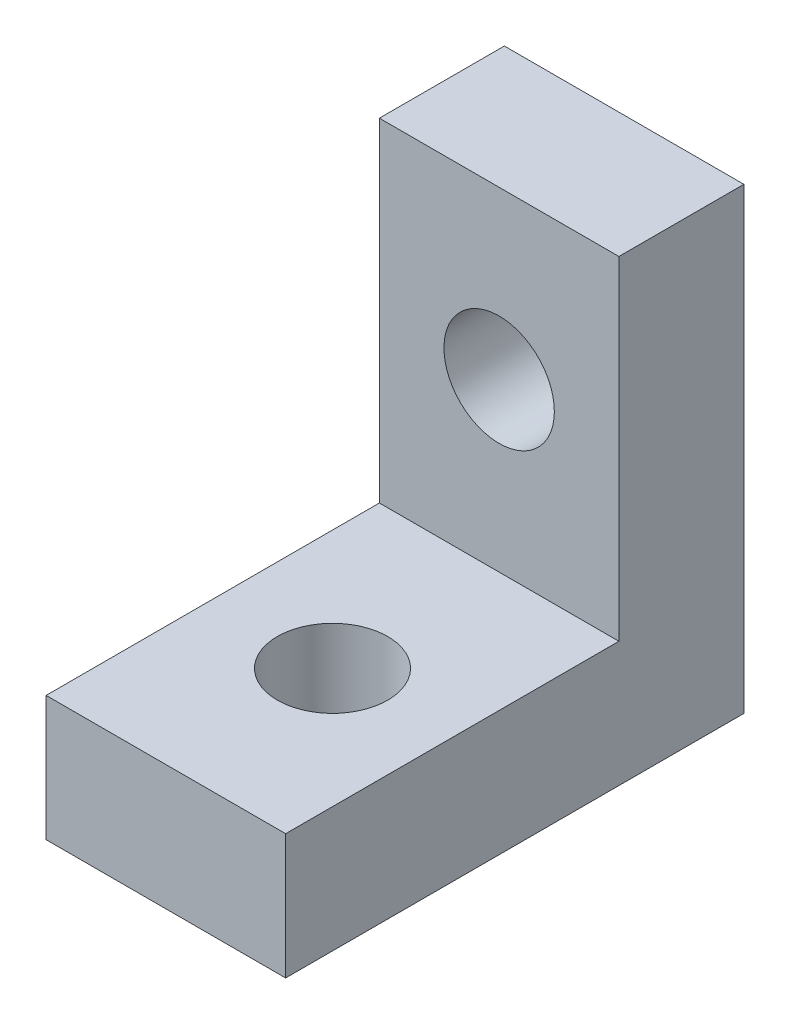
ISO-10303-21;
HEADER;
FILE_DESCRIPTION(('STEP AP214'),'2;1');
FILE_NAME('part.step','',(''),(''),'','','');
FILE_SCHEMA(('AUTOMOTIVE_DESIGN { 1 0 10303 214 1 1 1 1 }'));
ENDSEC;
DATA;
#1=APPLICATION_CONTEXT('core data for automotive mechanical design processes');
#2=APPLICATION_PROTOCOL_DEFINITION('international standard','automotive_design',2000,#1);
#3=PRODUCT_CONTEXT('',#1,'mechanical');
#4=PRODUCT('Part','Part','',(#3));
#5=PRODUCT_RELATED_PRODUCT_CATEGORY('part','',(#4));
#6=PRODUCT_DEFINITION_FORMATION('','',#4);
#7=PRODUCT_DEFINITION_CONTEXT('part definition',#1,'design');
#8=PRODUCT_DEFINITION('design','',#6,#7);
#9=PRODUCT_DEFINITION_SHAPE('','',#8);
#10=(LENGTH_UNIT() NAMED_UNIT(*) SI_UNIT(.MILLI.,.METRE.));
#11=(NAMED_UNIT(*) PLANE_ANGLE_UNIT() SI_UNIT($,.RADIAN.));
#12=(NAMED_UNIT(*) SI_UNIT($,.STERADIAN.) SOLID_ANGLE_UNIT());
#13=UNCERTAINTY_MEASURE_WITH_UNIT(LENGTH_MEASURE(1.E-05),#10,'distance_accuracy_value','');
#14=(GEOMETRIC_REPRESENTATION_CONTEXT(3) GLOBAL_UNCERTAINTY_ASSIGNED_CONTEXT((#13)) GLOBAL_UNIT_ASSIGNED_CONTEXT((#10,
#11,#12)) REPRESENTATION_CONTEXT('',''));
#15=CARTESIAN_POINT('',(0.,0.,0.));
#16=DIRECTION('',(0.,0.,1.));
#17=DIRECTION('',(1.,0.,0.));
#18=AXIS2_PLACEMENT_3D('',#15,#16,#17);
#19=CARTESIAN_POINT('',(-11.5,6.,0.));
#20=DIRECTION('',(0.,0.,1.));
#21=DIRECTION('',(0.,-1.,0.));
#22=AXIS2_PLACEMENT_3D('',#19,#20,#21);
#23=PLANE('',#22);
#24=DIRECTION('',(0.,-1.,0.));
#25=VECTOR('',#24,1.);
#26=CARTESIAN_POINT('',(0.,6.,0.));
#27=LINE('',#26,#25);
#28=CARTESIAN_POINT('',(0.,6.,0.));
#29=VERTEX_POINT('',#28);
#30=CARTESIAN_POINT('',(0.,0.,0.));
#31=VERTEX_POINT('',#30);
#32=EDGE_CURVE('E117',#29,#31,#27,.T.);
#33=ORIENTED_EDGE('',*,*,#32,.F.);
#34=DIRECTION('',(1.,0.,0.));
#35=VECTOR('',#34,1.);
#36=CARTESIAN_POINT('',(-11.5,6.,0.));
#37=LINE('',#36,#35);
#38=CARTESIAN_POINT('',(-11.5,6.,0.));
#39=VERTEX_POINT('',#38);
#40=EDGE_CURVE('E11',#39,#29,#37,.T.);
#41=ORIENTED_EDGE('',*,*,#40,.F.);
#42=DIRECTION('',(0.,-1.,0.));
#43=VECTOR('',#42,1.);
#44=CARTESIAN_POINT('',(-11.5,6.,0.));
#45=LINE('',#44,#43);
#46=CARTESIAN_POINT('',(-11.5,0.,0.));
#47=VERTEX_POINT('',#46);
#48=EDGE_CURVE('E132',#39,#47,#45,.T.);
#49=ORIENTED_EDGE('',*,*,#48,.T.);
#50=DIRECTION('',(1.,0.,0.));
#51=VECTOR('',#50,1.);
#52=CARTESIAN_POINT('',(-11.5,0.,0.));
#53=LINE('',#52,#51);
#54=EDGE_CURVE('E35',#47,#31,#53,.T.);
#55=ORIENTED_EDGE('',*,*,#54,.T.);
#56=EDGE_LOOP('',(#33,#41,#49,#55));
#57=FACE_BOUND('',#56,.T.);
#58=ADVANCED_FACE('F32',(#57),#23,.T.);
#59=CARTESIAN_POINT('',(-11.5,6.,-16.));
#60=DIRECTION('',(0.,1.,0.));
#61=DIRECTION('',(0.,0.,1.));
#62=AXIS2_PLACEMENT_3D('',#59,#60,#61);
#63=PLANE('',#62);
#64=CARTESIAN_POINT('',(-5.75,6.,-8.));
#65=DIRECTION('',(0.,1.,0.));
#66=DIRECTION('',(0.,0.,1.));
#67=AXIS2_PLACEMENT_3D('',#64,#65,#66);
#68=CIRCLE('',#67,2.65);
#69=CARTESIAN_POINT('',(-5.75,6.,-5.35));
#70=VERTEX_POINT('',#69);
#71=EDGE_CURVE('E167',#70,#70,#68,.T.);
#72=ORIENTED_EDGE('',*,*,#71,.F.);
#73=EDGE_LOOP('',(#72));
#74=FACE_BOUND('',#73,.T.);
#75=DIRECTION('',(0.,0.,1.));
#76=VECTOR('',#75,1.);
#77=CARTESIAN_POINT('',(0.,6.,-16.));
#78=LINE('',#77,#76);
#79=CARTESIAN_POINT('',(0.,6.,-16.));
#80=VERTEX_POINT('',#79);
#81=EDGE_CURVE('E130',#80,#29,#78,.T.);
#82=ORIENTED_EDGE('',*,*,#81,.F.);
#83=DIRECTION('',(1.,0.,0.));
#84=VECTOR('',#83,1.);
#85=CARTESIAN_POINT('',(-11.5,6.,-16.));
#86=LINE('',#85,#84);
#87=CARTESIAN_POINT('',(-11.5,6.,-16.));
#88=VERTEX_POINT('',#87);
#89=EDGE_CURVE('E41',#88,#80,#86,.T.);
#90=ORIENTED_EDGE('',*,*,#89,.F.);
#91=DIRECTION('',(0.,0.,1.));
#92=VECTOR('',#91,1.);
#93=CARTESIAN_POINT('',(-11.5,6.,-16.));
#94=LINE('',#93,#92);
#95=EDGE_CURVE('E107',#88,#39,#94,.T.);
#96=ORIENTED_EDGE('',*,*,#95,.T.);
#97=ORIENTED_EDGE('',*,*,#40,.T.);
#98=EDGE_LOOP('',(#82,#90,#96,#97));
#99=FACE_BOUND('',#98,.T.);
#100=ADVANCED_FACE('F140',(#74,#99),#63,.T.);
#101=CARTESIAN_POINT('',(-11.5,22.,-16.));
#102=DIRECTION('',(0.,0.,1.));
#103=DIRECTION('',(0.,-1.,0.));
#104=AXIS2_PLACEMENT_3D('',#101,#102,#103);
#105=PLANE('',#104);
#106=CARTESIAN_POINT('',(-5.75,14.,-16.));
#107=DIRECTION('',(0.,0.,1.));
#108=DIRECTION('',(1.,0.,0.));
#109=AXIS2_PLACEMENT_3D('',#106,#107,#108);
#110=CIRCLE('',#109,2.65);
#111=CARTESIAN_POINT('',(-3.1,14.,-16.));
#112=VERTEX_POINT('',#111);
#113=EDGE_CURVE('E173',#112,#112,#110,.T.);
#114=ORIENTED_EDGE('',*,*,#113,.F.);
#115=EDGE_LOOP('',(#114));
#116=FACE_BOUND('',#115,.T.);
#117=DIRECTION('',(0.,-1.,0.));
#118=VECTOR('',#117,1.);
#119=CARTESIAN_POINT('',(0.,22.,-16.));
#120=LINE('',#119,#118);
#121=CARTESIAN_POINT('',(0.,22.,-16.));
#122=VERTEX_POINT('',#121);
#123=EDGE_CURVE('E94',#122,#80,#120,.T.);
#124=ORIENTED_EDGE('',*,*,#123,.F.);
#125=DIRECTION('',(1.,0.,0.));
#126=VECTOR('',#125,1.);
#127=CARTESIAN_POINT('',(-11.5,22.,-16.));
#128=LINE('',#127,#126);
#129=CARTESIAN_POINT('',(-11.5,22.,-16.));
#130=VERTEX_POINT('',#129);
#131=EDGE_CURVE('E89',#130,#122,#128,.T.);
#132=ORIENTED_EDGE('',*,*,#131,.F.);
#133=DIRECTION('',(0.,-1.,0.));
#134=VECTOR('',#133,1.);
#135=CARTESIAN_POINT('',(-11.5,22.,-16.));
#136=LINE('',#135,#134);
#137=EDGE_CURVE('E92',#130,#88,#136,.T.);
#138=ORIENTED_EDGE('',*,*,#137,.T.);
#139=ORIENTED_EDGE('',*,*,#89,.T.);
#140=EDGE_LOOP('',(#124,#132,#138,#139));
#141=FACE_BOUND('',#140,.T.);
#142=ADVANCED_FACE('F91',(#116,#141),#105,.T.);
#143=CARTESIAN_POINT('',(-11.5,22.,-22.));
#144=DIRECTION('',(0.,1.,0.));
#145=DIRECTION('',(0.,0.,1.));
#146=AXIS2_PLACEMENT_3D('',#143,#144,#145);
#147=PLANE('',#146);
#148=DIRECTION('',(0.,0.,1.));
#149=VECTOR('',#148,1.);
#150=CARTESIAN_POINT('',(0.,22.,-22.));
#151=LINE('',#150,#149);
#152=CARTESIAN_POINT('',(0.,22.,-22.));
#153=VERTEX_POINT('',#152);
#154=EDGE_CURVE('E127',#153,#122,#151,.T.);
#155=ORIENTED_EDGE('',*,*,#154,.F.);
#156=DIRECTION('',(1.,0.,0.));
#157=VECTOR('',#156,1.);
#158=CARTESIAN_POINT('',(-11.5,22.,-22.));
#159=LINE('',#158,#157);
#160=CARTESIAN_POINT('',(-11.5,22.,-22.));
#161=VERTEX_POINT('',#160);
#162=EDGE_CURVE('E99',#161,#153,#159,.T.);
#163=ORIENTED_EDGE('',*,*,#162,.F.);
#164=DIRECTION('',(0.,0.,1.));
#165=VECTOR('',#164,1.);
#166=CARTESIAN_POINT('',(-11.5,22.,-22.));
#167=LINE('',#166,#165);
#168=EDGE_CURVE('E105',#161,#130,#167,.T.);
#169=ORIENTED_EDGE('',*,*,#168,.T.);
#170=ORIENTED_EDGE('',*,*,#131,.T.);
#171=EDGE_LOOP('',(#155,#163,#169,#170));
#172=FACE_BOUND('',#171,.T.);
#173=ADVANCED_FACE('F109',(#172),#147,.T.);
#174=CARTESIAN_POINT('',(-11.5,0.,-22.));
#175=DIRECTION('',(0.,0.,-1.));
#176=DIRECTION('',(-1.,0.,0.));
#177=AXIS2_PLACEMENT_3D('',#174,#175,#176);
#178=PLANE('',#177);
#179=CARTESIAN_POINT('',(-5.75,14.,-22.));
#180=DIRECTION('',(0.,0.,1.));
#181=DIRECTION('',(1.,0.,0.));
#182=AXIS2_PLACEMENT_3D('',#179,#180,#181);
#183=CIRCLE('',#182,2.65);
#184=CARTESIAN_POINT('',(-3.1,14.,-22.));
#185=VERTEX_POINT('',#184);
#186=EDGE_CURVE('E170',#185,#185,#183,.T.);
#187=ORIENTED_EDGE('',*,*,#186,.T.);
#188=EDGE_LOOP('',(#187));
#189=FACE_BOUND('',#188,.T.);
#190=DIRECTION('',(0.,1.,0.));
#191=VECTOR('',#190,1.);
#192=CARTESIAN_POINT('',(0.,0.,-22.));
#193=LINE('',#192,#191);
#194=CARTESIAN_POINT('',(0.,0.,-22.));
#195=VERTEX_POINT('',#194);
#196=EDGE_CURVE('E124',#195,#153,#193,.T.);
#197=ORIENTED_EDGE('',*,*,#196,.F.);
#198=DIRECTION('',(1.,0.,0.));
#199=VECTOR('',#198,1.);
#200=CARTESIAN_POINT('',(-11.5,0.,-22.));
#201=LINE('',#200,#199);
#202=CARTESIAN_POINT('',(-11.5,0.,-22.));
#203=VERTEX_POINT('',#202);
#204=EDGE_CURVE('E135',#203,#195,#201,.T.);
#205=ORIENTED_EDGE('',*,*,#204,.F.);
#206=DIRECTION('',(0.,1.,0.));
#207=VECTOR('',#206,1.);
#208=CARTESIAN_POINT('',(-11.5,0.,-22.));
#209=LINE('',#208,#207);
#210=EDGE_CURVE('E110',#203,#161,#209,.T.);
#211=ORIENTED_EDGE('',*,*,#210,.T.);
#212=ORIENTED_EDGE('',*,*,#162,.T.);
#213=EDGE_LOOP('',(#197,#205,#211,#212));
#214=FACE_BOUND('',#213,.T.);
#215=ADVANCED_FACE('F156',(#189,#214),#178,.T.);
#216=CARTESIAN_POINT('',(-11.5,0.,0.));
#217=DIRECTION('',(0.,-1.,0.));
#218=DIRECTION('',(0.,0.,-1.));
#219=AXIS2_PLACEMENT_3D('',#216,#217,#218);
#220=PLANE('',#219);
#221=CARTESIAN_POINT('',(-5.75,0.,-8.));
#222=DIRECTION('',(0.,1.,0.));
#223=DIRECTION('',(0.,0.,1.));
#224=AXIS2_PLACEMENT_3D('',#221,#222,#223);
#225=CIRCLE('',#224,2.65);
#226=CARTESIAN_POINT('',(-5.75,0.,-5.35));
#227=VERTEX_POINT('',#226);
#228=EDGE_CURVE('E121',#227,#227,#225,.T.);
#229=ORIENTED_EDGE('',*,*,#228,.T.);
#230=EDGE_LOOP('',(#229));
#231=FACE_BOUND('',#230,.T.);
#232=DIRECTION('',(0.,0.,-1.));
#233=VECTOR('',#232,1.);
#234=CARTESIAN_POINT('',(0.,0.,0.));
#235=LINE('',#234,#233);
#236=EDGE_CURVE('E120',#31,#195,#235,.T.);
#237=ORIENTED_EDGE('',*,*,#236,.F.);
#238=ORIENTED_EDGE('',*,*,#54,.F.);
#239=DIRECTION('',(0.,0.,-1.));
#240=VECTOR('',#239,1.);
#241=CARTESIAN_POINT('',(-11.5,0.,0.));
#242=LINE('',#241,#240);
#243=EDGE_CURVE('E112',#47,#203,#242,.T.);
#244=ORIENTED_EDGE('',*,*,#243,.T.);
#245=ORIENTED_EDGE('',*,*,#204,.T.);
#246=EDGE_LOOP('',(#237,#238,#244,#245));
#247=FACE_BOUND('',#246,.T.);
#248=ADVANCED_FACE('F137',(#231,#247),#220,.T.);
#249=CARTESIAN_POINT('',(-11.5,0.,0.));
#250=DIRECTION('',(1.,0.,0.));
#251=DIRECTION('',(0.,0.,-1.));
#252=AXIS2_PLACEMENT_3D('',#249,#250,#251);
#253=PLANE('',#252);
#254=ORIENTED_EDGE('',*,*,#48,.F.);
#255=ORIENTED_EDGE('',*,*,#95,.F.);
#256=ORIENTED_EDGE('',*,*,#137,.F.);
#257=ORIENTED_EDGE('',*,*,#168,.F.);
#258=ORIENTED_EDGE('',*,*,#210,.F.);
#259=ORIENTED_EDGE('',*,*,#243,.F.);
#260=EDGE_LOOP('',(#254,#255,#256,#257,#258,#259));
#261=FACE_BOUND('',#260,.T.);
#262=ADVANCED_FACE('F103',(#261),#253,.F.);
#263=CARTESIAN_POINT('',(0.,0.,0.));
#264=DIRECTION('',(1.,0.,0.));
#265=DIRECTION('',(0.,0.,-1.));
#266=AXIS2_PLACEMENT_3D('',#263,#264,#265);
#267=PLANE('',#266);
#268=ORIENTED_EDGE('',*,*,#32,.T.);
#269=ORIENTED_EDGE('',*,*,#236,.T.);
#270=ORIENTED_EDGE('',*,*,#196,.T.);
#271=ORIENTED_EDGE('',*,*,#154,.T.);
#272=ORIENTED_EDGE('',*,*,#123,.T.);
#273=ORIENTED_EDGE('',*,*,#81,.T.);
#274=EDGE_LOOP('',(#268,#269,#270,#271,#272,#273));
#275=FACE_BOUND('',#274,.T.);
#276=ADVANCED_FACE('F139',(#275),#267,.T.);
#277=CARTESIAN_POINT('',(-5.75,0.,-8.));
#278=DIRECTION('',(0.,1.,0.));
#279=DIRECTION('',(0.,0.,1.));
#280=AXIS2_PLACEMENT_3D('',#277,#278,#279);
#281=CYLINDRICAL_SURFACE('',#280,2.65);
#282=ORIENTED_EDGE('',*,*,#228,.F.);
#283=EDGE_LOOP('',(#282));
#284=FACE_BOUND('',#283,.T.);
#285=ORIENTED_EDGE('',*,*,#71,.T.);
#286=EDGE_LOOP('',(#285));
#287=FACE_BOUND('',#286,.T.);
#288=ADVANCED_FACE('F184',(#284,#287),#281,.F.);
#289=CARTESIAN_POINT('',(-5.75,14.,-22.));
#290=DIRECTION('',(0.,0.,1.));
#291=DIRECTION('',(1.,0.,0.));
#292=AXIS2_PLACEMENT_3D('',#289,#290,#291);
#293=CYLINDRICAL_SURFACE('',#292,2.65);
#294=ORIENTED_EDGE('',*,*,#186,.F.);
#295=EDGE_LOOP('',(#294));
#296=FACE_BOUND('',#295,.T.);
#297=ORIENTED_EDGE('',*,*,#113,.T.);
#298=EDGE_LOOP('',(#297));
#299=FACE_BOUND('',#298,.T.);
#300=ADVANCED_FACE('F181',(#296,#299),#293,.F.);
#301=CLOSED_SHELL('',(#58,#100,#142,#173,#215,#248,#262,#276,#288,#300));
#302=MANIFOLD_SOLID_BREP('B2',#301);
#303=ADVANCED_BREP_SHAPE_REPRESENTATION('',(#18,#302),#14);
#304=SHAPE_DEFINITION_REPRESENTATION(#9,#303);
ENDSEC;
END-ISO-10303-21;
